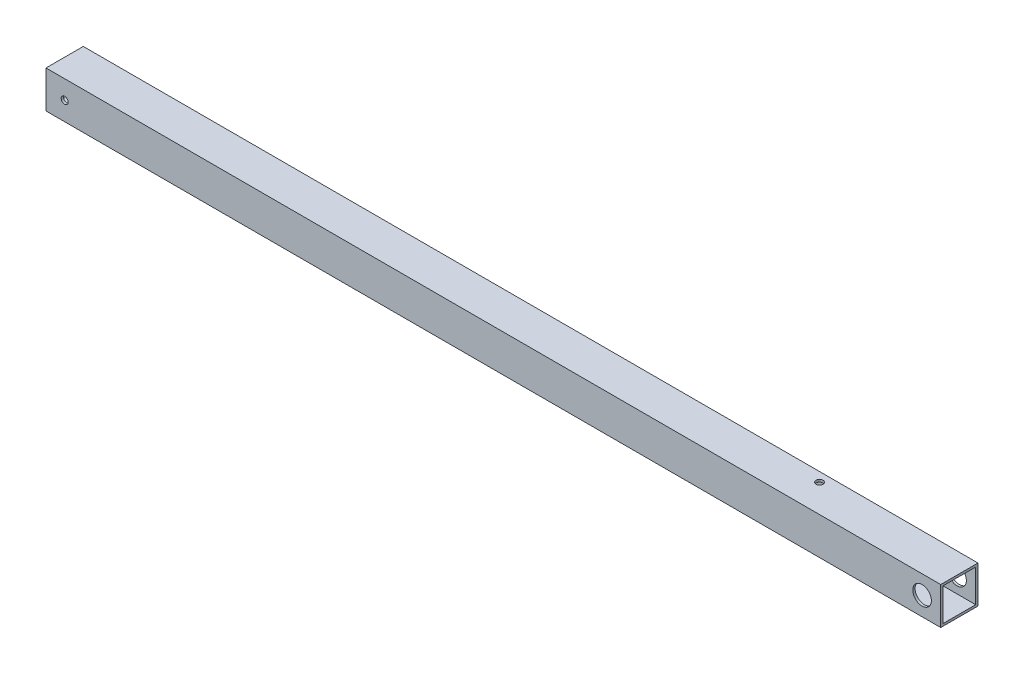
ISO-10303-21;
HEADER;
FILE_DESCRIPTION(('STEP AP214'),'2;1');
FILE_NAME('part.step','',(''),(''),'','','');
FILE_SCHEMA(('AUTOMOTIVE_DESIGN { 1 0 10303 214 1 1 1 1 }'));
ENDSEC;
DATA;
#1=APPLICATION_CONTEXT('core data for automotive mechanical design processes');
#2=APPLICATION_PROTOCOL_DEFINITION('international standard','automotive_design',2000,#1);
#3=PRODUCT_CONTEXT('',#1,'mechanical');
#4=PRODUCT('Part','Part','',(#3));
#5=PRODUCT_RELATED_PRODUCT_CATEGORY('part','',(#4));
#6=PRODUCT_DEFINITION_FORMATION('','',#4);
#7=PRODUCT_DEFINITION_CONTEXT('part definition',#1,'design');
#8=PRODUCT_DEFINITION('design','',#6,#7);
#9=PRODUCT_DEFINITION_SHAPE('','',#8);
#10=(LENGTH_UNIT() NAMED_UNIT(*) SI_UNIT(.MILLI.,.METRE.));
#11=(NAMED_UNIT(*) PLANE_ANGLE_UNIT() SI_UNIT($,.RADIAN.));
#12=(NAMED_UNIT(*) SI_UNIT($,.STERADIAN.) SOLID_ANGLE_UNIT());
#13=UNCERTAINTY_MEASURE_WITH_UNIT(LENGTH_MEASURE(1.E-05),#10,'distance_accuracy_value','');
#14=(GEOMETRIC_REPRESENTATION_CONTEXT(3) GLOBAL_UNCERTAINTY_ASSIGNED_CONTEXT((#13)) GLOBAL_UNIT_ASSIGNED_CONTEXT((#10,
#11,#12)) REPRESENTATION_CONTEXT('',''));
#15=CARTESIAN_POINT('',(0.,0.,0.));
#16=DIRECTION('',(0.,0.,1.));
#17=DIRECTION('',(1.,0.,0.));
#18=AXIS2_PLACEMENT_3D('',#15,#16,#17);
#19=CARTESIAN_POINT('',(0.,0.,-25.4));
#20=DIRECTION('',(-1.,0.,0.));
#21=DIRECTION('',(0.,0.,1.));
#22=AXIS2_PLACEMENT_3D('',#19,#20,#21);
#23=PLANE('',#22);
#24=DIRECTION('',(0.,1.,0.));
#25=VECTOR('',#24,1.);
#26=CARTESIAN_POINT('',(0.,-23.8125,-1.5875));
#27=LINE('',#26,#25);
#28=CARTESIAN_POINT('',(0.,-23.8125,-1.5875));
#29=VERTEX_POINT('',#28);
#30=CARTESIAN_POINT('',(0.,-1.58750000000001,-1.5875));
#31=VERTEX_POINT('',#30);
#32=EDGE_CURVE('E49',#29,#31,#27,.T.);
#33=ORIENTED_EDGE('',*,*,#32,.F.);
#34=DIRECTION('',(0.,0.,1.));
#35=VECTOR('',#34,1.);
#36=CARTESIAN_POINT('',(0.,-23.8125,-23.8125));
#37=LINE('',#36,#35);
#38=CARTESIAN_POINT('',(0.,-23.8125,-23.8125));
#39=VERTEX_POINT('',#38);
#40=EDGE_CURVE('E116',#39,#29,#37,.T.);
#41=ORIENTED_EDGE('',*,*,#40,.F.);
#42=DIRECTION('',(0.,-1.,0.));
#43=VECTOR('',#42,1.);
#44=CARTESIAN_POINT('',(0.,-1.58750000000001,-23.8125));
#45=LINE('',#44,#43);
#46=CARTESIAN_POINT('',(0.,-1.58750000000001,-23.8125));
#47=VERTEX_POINT('',#46);
#48=EDGE_CURVE('E119',#47,#39,#45,.T.);
#49=ORIENTED_EDGE('',*,*,#48,.F.);
#50=DIRECTION('',(0.,0.,-1.));
#51=VECTOR('',#50,1.);
#52=CARTESIAN_POINT('',(0.,-1.58750000000001,-1.5875));
#53=LINE('',#52,#51);
#54=EDGE_CURVE('E128',#31,#47,#53,.T.);
#55=ORIENTED_EDGE('',*,*,#54,.F.);
#56=EDGE_LOOP('',(#33,#41,#49,#55));
#57=FACE_BOUND('',#56,.T.);
#58=DIRECTION('',(0.,-1.,0.));
#59=VECTOR('',#58,1.);
#60=CARTESIAN_POINT('',(0.,0.,0.));
#61=LINE('',#60,#59);
#62=CARTESIAN_POINT('',(0.,0.,0.));
#63=VERTEX_POINT('',#62);
#64=CARTESIAN_POINT('',(0.,-25.4,0.));
#65=VERTEX_POINT('',#64);
#66=EDGE_CURVE('E134',#63,#65,#61,.T.);
#67=ORIENTED_EDGE('',*,*,#66,.F.);
#68=DIRECTION('',(0.,0.,1.));
#69=VECTOR('',#68,1.);
#70=CARTESIAN_POINT('',(0.,0.,-25.4));
#71=LINE('',#70,#69);
#72=CARTESIAN_POINT('',(0.,0.,-25.4));
#73=VERTEX_POINT('',#72);
#74=EDGE_CURVE('E11',#73,#63,#71,.T.);
#75=ORIENTED_EDGE('',*,*,#74,.F.);
#76=DIRECTION('',(0.,-1.,0.));
#77=VECTOR('',#76,1.);
#78=CARTESIAN_POINT('',(0.,0.,-25.4));
#79=LINE('',#78,#77);
#80=CARTESIAN_POINT('',(0.,-25.4,-25.4));
#81=VERTEX_POINT('',#80);
#82=EDGE_CURVE('E138',#73,#81,#79,.T.);
#83=ORIENTED_EDGE('',*,*,#82,.T.);
#84=DIRECTION('',(0.,0.,1.));
#85=VECTOR('',#84,1.);
#86=CARTESIAN_POINT('',(0.,-25.4,-25.4));
#87=LINE('',#86,#85);
#88=EDGE_CURVE('E36',#81,#65,#87,.T.);
#89=ORIENTED_EDGE('',*,*,#88,.T.);
#90=EDGE_LOOP('',(#67,#75,#83,#89));
#91=FACE_BOUND('',#90,.T.);
#92=ADVANCED_FACE('F33',(#57,#91),#23,.T.);
#93=CARTESIAN_POINT('',(609.6,0.,-25.4));
#94=DIRECTION('',(0.,1.,0.));
#95=DIRECTION('',(0.,0.,1.));
#96=AXIS2_PLACEMENT_3D('',#93,#94,#95);
#97=PLANE('',#96);
#98=CARTESIAN_POINT('',(508.,0.,-19.05));
#99=DIRECTION('',(0.,1.,0.));
#100=DIRECTION('',(0.,0.,1.));
#101=AXIS2_PLACEMENT_3D('',#98,#99,#100);
#102=CIRCLE('',#101,2.40030000000002);
#103=CARTESIAN_POINT('',(508.,0.,-16.6497));
#104=VERTEX_POINT('',#103);
#105=EDGE_CURVE('E287',#104,#104,#102,.T.);
#106=ORIENTED_EDGE('',*,*,#105,.F.);
#107=EDGE_LOOP('',(#106));
#108=FACE_BOUND('',#107,.T.);
#109=DIRECTION('',(-1.,0.,0.));
#110=VECTOR('',#109,1.);
#111=CARTESIAN_POINT('',(609.6,0.,0.));
#112=LINE('',#111,#110);
#113=CARTESIAN_POINT('',(609.6,0.,0.));
#114=VERTEX_POINT('',#113);
#115=EDGE_CURVE('E142',#114,#63,#112,.T.);
#116=ORIENTED_EDGE('',*,*,#115,.F.);
#117=DIRECTION('',(0.,0.,1.));
#118=VECTOR('',#117,1.);
#119=CARTESIAN_POINT('',(609.6,0.,-25.4));
#120=LINE('',#119,#118);
#121=CARTESIAN_POINT('',(609.6,0.,-25.4));
#122=VERTEX_POINT('',#121);
#123=EDGE_CURVE('E41',#122,#114,#120,.T.);
#124=ORIENTED_EDGE('',*,*,#123,.F.);
#125=DIRECTION('',(-1.,0.,0.));
#126=VECTOR('',#125,1.);
#127=CARTESIAN_POINT('',(609.6,0.,-25.4));
#128=LINE('',#127,#126);
#129=EDGE_CURVE('E148',#122,#73,#128,.T.);
#130=ORIENTED_EDGE('',*,*,#129,.T.);
#131=ORIENTED_EDGE('',*,*,#74,.T.);
#132=EDGE_LOOP('',(#116,#124,#130,#131));
#133=FACE_BOUND('',#132,.T.);
#134=ADVANCED_FACE('F174',(#108,#133),#97,.T.);
#135=CARTESIAN_POINT('',(609.6,-25.4,-25.4));
#136=DIRECTION('',(1.,0.,0.));
#137=DIRECTION('',(0.,0.,-1.));
#138=AXIS2_PLACEMENT_3D('',#135,#136,#137);
#139=PLANE('',#138);
#140=DIRECTION('',(0.,1.,0.));
#141=VECTOR('',#140,1.);
#142=CARTESIAN_POINT('',(609.6,-23.8125,-1.5875));
#143=LINE('',#142,#141);
#144=CARTESIAN_POINT('',(609.6,-23.8125,-1.5875));
#145=VERTEX_POINT('',#144);
#146=CARTESIAN_POINT('',(609.6,-1.58750000000001,-1.5875));
#147=VERTEX_POINT('',#146);
#148=EDGE_CURVE('E100',#145,#147,#143,.T.);
#149=ORIENTED_EDGE('',*,*,#148,.T.);
#150=DIRECTION('',(0.,0.,-1.));
#151=VECTOR('',#150,1.);
#152=CARTESIAN_POINT('',(609.6,-1.58750000000001,-1.5875));
#153=LINE('',#152,#151);
#154=CARTESIAN_POINT('',(609.6,-1.58750000000001,-23.8125));
#155=VERTEX_POINT('',#154);
#156=EDGE_CURVE('E109',#147,#155,#153,.T.);
#157=ORIENTED_EDGE('',*,*,#156,.T.);
#158=DIRECTION('',(0.,-1.,0.));
#159=VECTOR('',#158,1.);
#160=CARTESIAN_POINT('',(609.6,-1.58750000000001,-23.8125));
#161=LINE('',#160,#159);
#162=CARTESIAN_POINT('',(609.6,-23.8125,-23.8125));
#163=VERTEX_POINT('',#162);
#164=EDGE_CURVE('E57',#155,#163,#161,.T.);
#165=ORIENTED_EDGE('',*,*,#164,.T.);
#166=DIRECTION('',(0.,0.,1.));
#167=VECTOR('',#166,1.);
#168=CARTESIAN_POINT('',(609.6,-23.8125,-23.8125));
#169=LINE('',#168,#167);
#170=EDGE_CURVE('E106',#163,#145,#169,.T.);
#171=ORIENTED_EDGE('',*,*,#170,.T.);
#172=EDGE_LOOP('',(#149,#157,#165,#171));
#173=FACE_BOUND('',#172,.T.);
#174=DIRECTION('',(0.,1.,0.));
#175=VECTOR('',#174,1.);
#176=CARTESIAN_POINT('',(609.6,-25.4,0.));
#177=LINE('',#176,#175);
#178=CARTESIAN_POINT('',(609.6,-25.4,0.));
#179=VERTEX_POINT('',#178);
#180=EDGE_CURVE('E156',#179,#114,#177,.T.);
#181=ORIENTED_EDGE('',*,*,#180,.F.);
#182=DIRECTION('',(0.,0.,1.));
#183=VECTOR('',#182,1.);
#184=CARTESIAN_POINT('',(609.6,-25.4,-25.4));
#185=LINE('',#184,#183);
#186=CARTESIAN_POINT('',(609.6,-25.4,-25.4));
#187=VERTEX_POINT('',#186);
#188=EDGE_CURVE('E161',#187,#179,#185,.T.);
#189=ORIENTED_EDGE('',*,*,#188,.F.);
#190=DIRECTION('',(0.,1.,0.));
#191=VECTOR('',#190,1.);
#192=CARTESIAN_POINT('',(609.6,-25.4,-25.4));
#193=LINE('',#192,#191);
#194=EDGE_CURVE('E145',#187,#122,#193,.T.);
#195=ORIENTED_EDGE('',*,*,#194,.T.);
#196=ORIENTED_EDGE('',*,*,#123,.T.);
#197=EDGE_LOOP('',(#181,#189,#195,#196));
#198=FACE_BOUND('',#197,.T.);
#199=ADVANCED_FACE('F113',(#173,#198),#139,.T.);
#200=CARTESIAN_POINT('',(0.,-25.4,-25.4));
#201=DIRECTION('',(0.,-1.,0.));
#202=DIRECTION('',(0.,0.,-1.));
#203=AXIS2_PLACEMENT_3D('',#200,#201,#202);
#204=PLANE('',#203);
#205=CARTESIAN_POINT('',(508.,-25.4,-19.05));
#206=DIRECTION('',(0.,1.,0.));
#207=DIRECTION('',(0.,0.,1.));
#208=AXIS2_PLACEMENT_3D('',#205,#206,#207);
#209=CIRCLE('',#208,2.40030000000002);
#210=CARTESIAN_POINT('',(508.,-25.4,-16.6497));
#211=VERTEX_POINT('',#210);
#212=EDGE_CURVE('E122',#211,#211,#209,.T.);
#213=ORIENTED_EDGE('',*,*,#212,.T.);
#214=EDGE_LOOP('',(#213));
#215=FACE_BOUND('',#214,.T.);
#216=DIRECTION('',(1.,0.,0.));
#217=VECTOR('',#216,1.);
#218=CARTESIAN_POINT('',(0.,-25.4,0.));
#219=LINE('',#218,#217);
#220=EDGE_CURVE('E153',#65,#179,#219,.T.);
#221=ORIENTED_EDGE('',*,*,#220,.F.);
#222=ORIENTED_EDGE('',*,*,#88,.F.);
#223=DIRECTION('',(1.,0.,0.));
#224=VECTOR('',#223,1.);
#225=CARTESIAN_POINT('',(0.,-25.4,-25.4));
#226=LINE('',#225,#224);
#227=EDGE_CURVE('E141',#81,#187,#226,.T.);
#228=ORIENTED_EDGE('',*,*,#227,.T.);
#229=ORIENTED_EDGE('',*,*,#188,.T.);
#230=EDGE_LOOP('',(#221,#222,#228,#229));
#231=FACE_BOUND('',#230,.T.);
#232=ADVANCED_FACE('F169',(#215,#231),#204,.T.);
#233=CARTESIAN_POINT('',(0.,0.,-25.4));
#234=DIRECTION('',(0.,0.,1.));
#235=DIRECTION('',(1.,0.,0.));
#236=AXIS2_PLACEMENT_3D('',#233,#234,#235);
#237=PLANE('',#236);
#238=CARTESIAN_POINT('',(596.9,-12.7,-25.4));
#239=DIRECTION('',(0.,0.,1.));
#240=DIRECTION('',(1.,0.,0.));
#241=AXIS2_PLACEMENT_3D('',#238,#239,#240);
#242=CIRCLE('',#241,6.34999999999997);
#243=CARTESIAN_POINT('',(603.25,-12.7,-25.4));
#244=VERTEX_POINT('',#243);
#245=EDGE_CURVE('E243',#244,#244,#242,.T.);
#246=ORIENTED_EDGE('',*,*,#245,.T.);
#247=EDGE_LOOP('',(#246));
#248=FACE_BOUND('',#247,.T.);
#249=CARTESIAN_POINT('',(12.7,-12.7,-25.4));
#250=DIRECTION('',(0.,0.,1.));
#251=DIRECTION('',(1.,0.,0.));
#252=AXIS2_PLACEMENT_3D('',#249,#250,#251);
#253=CIRCLE('',#252,2.38124999999999);
#254=CARTESIAN_POINT('',(15.08125,-12.7,-25.4));
#255=VERTEX_POINT('',#254);
#256=EDGE_CURVE('E249',#255,#255,#253,.T.);
#257=ORIENTED_EDGE('',*,*,#256,.T.);
#258=EDGE_LOOP('',(#257));
#259=FACE_BOUND('',#258,.T.);
#260=ORIENTED_EDGE('',*,*,#82,.F.);
#261=ORIENTED_EDGE('',*,*,#129,.F.);
#262=ORIENTED_EDGE('',*,*,#194,.F.);
#263=ORIENTED_EDGE('',*,*,#227,.F.);
#264=EDGE_LOOP('',(#260,#261,#262,#263));
#265=FACE_BOUND('',#264,.T.);
#266=ADVANCED_FACE('F177',(#248,#259,#265),#237,.F.);
#267=CARTESIAN_POINT('',(0.,0.,0.));
#268=DIRECTION('',(0.,0.,1.));
#269=DIRECTION('',(1.,0.,0.));
#270=AXIS2_PLACEMENT_3D('',#267,#268,#269);
#271=PLANE('',#270);
#272=CARTESIAN_POINT('',(596.9,-12.7,0.));
#273=DIRECTION('',(0.,0.,1.));
#274=DIRECTION('',(1.,0.,0.));
#275=AXIS2_PLACEMENT_3D('',#272,#273,#274);
#276=CIRCLE('',#275,6.34999999999997);
#277=CARTESIAN_POINT('',(603.25,-12.7,0.));
#278=VERTEX_POINT('',#277);
#279=EDGE_CURVE('E226',#278,#278,#276,.T.);
#280=ORIENTED_EDGE('',*,*,#279,.F.);
#281=EDGE_LOOP('',(#280));
#282=FACE_BOUND('',#281,.T.);
#283=CARTESIAN_POINT('',(12.7,-12.7,0.));
#284=DIRECTION('',(0.,0.,1.));
#285=DIRECTION('',(1.,0.,0.));
#286=AXIS2_PLACEMENT_3D('',#283,#284,#285);
#287=CIRCLE('',#286,2.38124999999999);
#288=CARTESIAN_POINT('',(15.08125,-12.7,0.));
#289=VERTEX_POINT('',#288);
#290=EDGE_CURVE('E229',#289,#289,#287,.T.);
#291=ORIENTED_EDGE('',*,*,#290,.F.);
#292=EDGE_LOOP('',(#291));
#293=FACE_BOUND('',#292,.T.);
#294=ORIENTED_EDGE('',*,*,#66,.T.);
#295=ORIENTED_EDGE('',*,*,#220,.T.);
#296=ORIENTED_EDGE('',*,*,#180,.T.);
#297=ORIENTED_EDGE('',*,*,#115,.T.);
#298=EDGE_LOOP('',(#294,#295,#296,#297));
#299=FACE_BOUND('',#298,.T.);
#300=ADVANCED_FACE('F171',(#282,#293,#299),#271,.T.);
#301=CARTESIAN_POINT('',(609.6,-23.8125,-1.5875));
#302=DIRECTION('',(0.,0.,1.));
#303=DIRECTION('',(0.,-1.,0.));
#304=AXIS2_PLACEMENT_3D('',#301,#302,#303);
#305=PLANE('',#304);
#306=CARTESIAN_POINT('',(596.9,-12.7,-1.5875));
#307=DIRECTION('',(0.,0.,1.));
#308=DIRECTION('',(0.,-1.,0.));
#309=AXIS2_PLACEMENT_3D('',#306,#307,#308);
#310=CIRCLE('',#309,6.34999999999997);
#311=CARTESIAN_POINT('',(596.9,-19.05,-1.5875));
#312=VERTEX_POINT('',#311);
#313=EDGE_CURVE('E232',#312,#312,#310,.T.);
#314=ORIENTED_EDGE('',*,*,#313,.T.);
#315=EDGE_LOOP('',(#314));
#316=FACE_BOUND('',#315,.T.);
#317=CARTESIAN_POINT('',(12.7,-12.7,-1.5875));
#318=DIRECTION('',(0.,0.,1.));
#319=DIRECTION('',(0.,-1.,0.));
#320=AXIS2_PLACEMENT_3D('',#317,#318,#319);
#321=CIRCLE('',#320,2.38124999999999);
#322=CARTESIAN_POINT('',(12.7,-15.08125,-1.5875));
#323=VERTEX_POINT('',#322);
#324=EDGE_CURVE('E231',#323,#323,#321,.T.);
#325=ORIENTED_EDGE('',*,*,#324,.T.);
#326=EDGE_LOOP('',(#325));
#327=FACE_BOUND('',#326,.T.);
#328=ORIENTED_EDGE('',*,*,#32,.T.);
#329=DIRECTION('',(-1.,0.,0.));
#330=VECTOR('',#329,1.);
#331=CARTESIAN_POINT('',(609.6,-1.58750000000001,-1.5875));
#332=LINE('',#331,#330);
#333=EDGE_CURVE('E96',#147,#31,#332,.T.);
#334=ORIENTED_EDGE('',*,*,#333,.F.);
#335=ORIENTED_EDGE('',*,*,#148,.F.);
#336=DIRECTION('',(-1.,0.,0.));
#337=VECTOR('',#336,1.);
#338=CARTESIAN_POINT('',(609.6,-23.8125,-1.5875));
#339=LINE('',#338,#337);
#340=EDGE_CURVE('E132',#145,#29,#339,.T.);
#341=ORIENTED_EDGE('',*,*,#340,.T.);
#342=EDGE_LOOP('',(#328,#334,#335,#341));
#343=FACE_BOUND('',#342,.T.);
#344=ADVANCED_FACE('F98',(#316,#327,#343),#305,.F.);
#345=CARTESIAN_POINT('',(609.6,-23.8125,-23.8125));
#346=DIRECTION('',(0.,-1.,0.));
#347=DIRECTION('',(0.,0.,-1.));
#348=AXIS2_PLACEMENT_3D('',#345,#346,#347);
#349=PLANE('',#348);
#350=CARTESIAN_POINT('',(508.,-23.8125,-19.05));
#351=DIRECTION('',(0.,1.,0.));
#352=DIRECTION('',(0.,0.,1.));
#353=AXIS2_PLACEMENT_3D('',#350,#351,#352);
#354=CIRCLE('',#353,2.40030000000002);
#355=CARTESIAN_POINT('',(508.,-23.8125,-16.6497));
#356=VERTEX_POINT('',#355);
#357=EDGE_CURVE('E251',#356,#356,#354,.T.);
#358=ORIENTED_EDGE('',*,*,#357,.F.);
#359=EDGE_LOOP('',(#358));
#360=FACE_BOUND('',#359,.T.);
#361=ORIENTED_EDGE('',*,*,#40,.T.);
#362=ORIENTED_EDGE('',*,*,#340,.F.);
#363=ORIENTED_EDGE('',*,*,#170,.F.);
#364=DIRECTION('',(-1.,0.,0.));
#365=VECTOR('',#364,1.);
#366=CARTESIAN_POINT('',(609.6,-23.8125,-23.8125));
#367=LINE('',#366,#365);
#368=EDGE_CURVE('E135',#163,#39,#367,.T.);
#369=ORIENTED_EDGE('',*,*,#368,.T.);
#370=EDGE_LOOP('',(#361,#362,#363,#369));
#371=FACE_BOUND('',#370,.T.);
#372=ADVANCED_FACE('F196',(#360,#371),#349,.F.);
#373=CARTESIAN_POINT('',(609.6,-1.58750000000001,-23.8125));
#374=DIRECTION('',(0.,0.,-1.));
#375=DIRECTION('',(0.,1.,0.));
#376=AXIS2_PLACEMENT_3D('',#373,#374,#375);
#377=PLANE('',#376);
#378=CARTESIAN_POINT('',(596.9,-12.7,-23.8125));
#379=DIRECTION('',(0.,0.,1.));
#380=DIRECTION('',(1.,0.,0.));
#381=AXIS2_PLACEMENT_3D('',#378,#379,#380);
#382=CIRCLE('',#381,6.34999999999997);
#383=CARTESIAN_POINT('',(603.25,-12.7,-23.8125));
#384=VERTEX_POINT('',#383);
#385=EDGE_CURVE('E235',#384,#384,#382,.T.);
#386=ORIENTED_EDGE('',*,*,#385,.F.);
#387=EDGE_LOOP('',(#386));
#388=FACE_BOUND('',#387,.T.);
#389=CARTESIAN_POINT('',(12.7,-12.7,-23.8125));
#390=DIRECTION('',(0.,0.,1.));
#391=DIRECTION('',(1.,0.,0.));
#392=AXIS2_PLACEMENT_3D('',#389,#390,#391);
#393=CIRCLE('',#392,2.38124999999999);
#394=CARTESIAN_POINT('',(15.08125,-12.7,-23.8125));
#395=VERTEX_POINT('',#394);
#396=EDGE_CURVE('E246',#395,#395,#393,.T.);
#397=ORIENTED_EDGE('',*,*,#396,.F.);
#398=EDGE_LOOP('',(#397));
#399=FACE_BOUND('',#398,.T.);
#400=ORIENTED_EDGE('',*,*,#48,.T.);
#401=ORIENTED_EDGE('',*,*,#368,.F.);
#402=ORIENTED_EDGE('',*,*,#164,.F.);
#403=DIRECTION('',(-1.,0.,0.));
#404=VECTOR('',#403,1.);
#405=CARTESIAN_POINT('',(609.6,-1.58750000000001,-23.8125));
#406=LINE('',#405,#404);
#407=EDGE_CURVE('E105',#155,#47,#406,.T.);
#408=ORIENTED_EDGE('',*,*,#407,.T.);
#409=EDGE_LOOP('',(#400,#401,#402,#408));
#410=FACE_BOUND('',#409,.T.);
#411=ADVANCED_FACE('F194',(#388,#399,#410),#377,.F.);
#412=CARTESIAN_POINT('',(609.6,-1.58750000000001,-1.5875));
#413=DIRECTION('',(0.,1.,0.));
#414=DIRECTION('',(0.,0.,1.));
#415=AXIS2_PLACEMENT_3D('',#412,#413,#414);
#416=PLANE('',#415);
#417=CARTESIAN_POINT('',(508.,-1.58750000000001,-19.05));
#418=DIRECTION('',(0.,1.,0.));
#419=DIRECTION('',(0.,0.,1.));
#420=AXIS2_PLACEMENT_3D('',#417,#418,#419);
#421=CIRCLE('',#420,2.40030000000002);
#422=CARTESIAN_POINT('',(508.,-1.58750000000001,-16.6497));
#423=VERTEX_POINT('',#422);
#424=EDGE_CURVE('E290',#423,#423,#421,.T.);
#425=ORIENTED_EDGE('',*,*,#424,.T.);
#426=EDGE_LOOP('',(#425));
#427=FACE_BOUND('',#426,.T.);
#428=ORIENTED_EDGE('',*,*,#54,.T.);
#429=ORIENTED_EDGE('',*,*,#407,.F.);
#430=ORIENTED_EDGE('',*,*,#156,.F.);
#431=ORIENTED_EDGE('',*,*,#333,.T.);
#432=EDGE_LOOP('',(#428,#429,#430,#431));
#433=FACE_BOUND('',#432,.T.);
#434=ADVANCED_FACE('F110',(#427,#433),#416,.F.);
#435=CARTESIAN_POINT('',(508.,-23.8125,-19.05));
#436=DIRECTION('',(0.,1.,0.));
#437=DIRECTION('',(0.,0.,1.));
#438=AXIS2_PLACEMENT_3D('',#435,#436,#437);
#439=CYLINDRICAL_SURFACE('',#438,2.40030000000002);
#440=ORIENTED_EDGE('',*,*,#212,.F.);
#441=EDGE_LOOP('',(#440));
#442=FACE_BOUND('',#441,.T.);
#443=ORIENTED_EDGE('',*,*,#357,.T.);
#444=EDGE_LOOP('',(#443));
#445=FACE_BOUND('',#444,.T.);
#446=ADVANCED_FACE('F210',(#442,#445),#439,.F.);
#447=CARTESIAN_POINT('',(12.7,-12.7,-23.8125));
#448=DIRECTION('',(0.,0.,1.));
#449=DIRECTION('',(1.,0.,0.));
#450=AXIS2_PLACEMENT_3D('',#447,#448,#449);
#451=CYLINDRICAL_SURFACE('',#450,2.38124999999999);
#452=ORIENTED_EDGE('',*,*,#256,.F.);
#453=EDGE_LOOP('',(#452));
#454=FACE_BOUND('',#453,.T.);
#455=ORIENTED_EDGE('',*,*,#396,.T.);
#456=EDGE_LOOP('',(#455));
#457=FACE_BOUND('',#456,.T.);
#458=ADVANCED_FACE('F258',(#454,#457),#451,.F.);
#459=CARTESIAN_POINT('',(596.9,-12.7,-23.8125));
#460=DIRECTION('',(0.,0.,1.));
#461=DIRECTION('',(1.,0.,0.));
#462=AXIS2_PLACEMENT_3D('',#459,#460,#461);
#463=CYLINDRICAL_SURFACE('',#462,6.34999999999997);
#464=ORIENTED_EDGE('',*,*,#245,.F.);
#465=EDGE_LOOP('',(#464));
#466=FACE_BOUND('',#465,.T.);
#467=ORIENTED_EDGE('',*,*,#385,.T.);
#468=EDGE_LOOP('',(#467));
#469=FACE_BOUND('',#468,.T.);
#470=ADVANCED_FACE('F262',(#466,#469),#463,.F.);
#471=CARTESIAN_POINT('',(12.7,-12.7,0.));
#472=DIRECTION('',(0.,0.,1.));
#473=DIRECTION('',(1.,0.,0.));
#474=AXIS2_PLACEMENT_3D('',#471,#472,#473);
#475=CYLINDRICAL_SURFACE('',#474,2.38124999999999);
#476=ORIENTED_EDGE('',*,*,#290,.T.);
#477=EDGE_LOOP('',(#476));
#478=FACE_BOUND('',#477,.T.);
#479=ORIENTED_EDGE('',*,*,#324,.F.);
#480=EDGE_LOOP('',(#479));
#481=FACE_BOUND('',#480,.T.);
#482=ADVANCED_FACE('F267',(#478,#481),#475,.F.);
#483=CARTESIAN_POINT('',(596.9,-12.7,0.));
#484=DIRECTION('',(0.,0.,1.));
#485=DIRECTION('',(1.,0.,0.));
#486=AXIS2_PLACEMENT_3D('',#483,#484,#485);
#487=CYLINDRICAL_SURFACE('',#486,6.34999999999997);
#488=ORIENTED_EDGE('',*,*,#279,.T.);
#489=EDGE_LOOP('',(#488));
#490=FACE_BOUND('',#489,.T.);
#491=ORIENTED_EDGE('',*,*,#313,.F.);
#492=EDGE_LOOP('',(#491));
#493=FACE_BOUND('',#492,.T.);
#494=ADVANCED_FACE('F275',(#490,#493),#487,.F.);
#495=CARTESIAN_POINT('',(508.,0.,-19.05));
#496=DIRECTION('',(0.,1.,0.));
#497=DIRECTION('',(0.,0.,1.));
#498=AXIS2_PLACEMENT_3D('',#495,#496,#497);
#499=CYLINDRICAL_SURFACE('',#498,2.40030000000002);
#500=ORIENTED_EDGE('',*,*,#105,.T.);
#501=EDGE_LOOP('',(#500));
#502=FACE_BOUND('',#501,.T.);
#503=ORIENTED_EDGE('',*,*,#424,.F.);
#504=EDGE_LOOP('',(#503));
#505=FACE_BOUND('',#504,.T.);
#506=ADVANCED_FACE('F278',(#502,#505),#499,.F.);
#507=CLOSED_SHELL('',(#92,#134,#199,#232,#266,#300,#344,#372,#411,#434,#446,#458,#470,#482,#494,#506));
#508=MANIFOLD_SOLID_BREP('B2',#507);
#509=ADVANCED_BREP_SHAPE_REPRESENTATION('',(#18,#508),#14);
#510=SHAPE_DEFINITION_REPRESENTATION(#9,#509);
ENDSEC;
END-ISO-10303-21;
